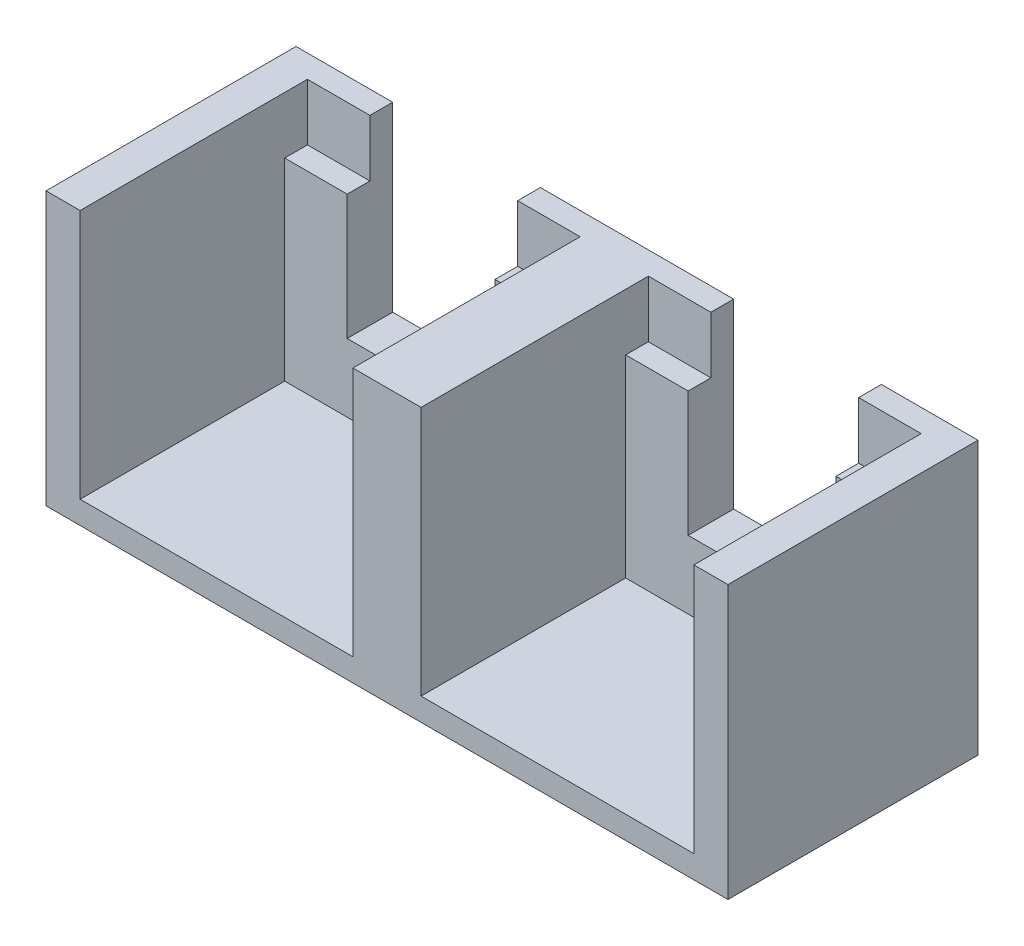
ISO-10303-21;
HEADER;
FILE_DESCRIPTION(('STEP AP214'),'2;1');
FILE_NAME('part.step','',(''),(''),'','','');
FILE_SCHEMA(('AUTOMOTIVE_DESIGN { 1 0 10303 214 1 1 1 1 }'));
ENDSEC;
DATA;
#1=APPLICATION_CONTEXT('core data for automotive mechanical design processes');
#2=APPLICATION_PROTOCOL_DEFINITION('international standard','automotive_design',2000,#1);
#3=PRODUCT_CONTEXT('',#1,'mechanical');
#4=PRODUCT('Part','Part','',(#3));
#5=PRODUCT_RELATED_PRODUCT_CATEGORY('part','',(#4));
#6=PRODUCT_DEFINITION_FORMATION('','',#4);
#7=PRODUCT_DEFINITION_CONTEXT('part definition',#1,'design');
#8=PRODUCT_DEFINITION('design','',#6,#7);
#9=PRODUCT_DEFINITION_SHAPE('','',#8);
#10=(LENGTH_UNIT() NAMED_UNIT(*) SI_UNIT(.MILLI.,.METRE.));
#11=(NAMED_UNIT(*) PLANE_ANGLE_UNIT() SI_UNIT($,.RADIAN.));
#12=(NAMED_UNIT(*) SI_UNIT($,.STERADIAN.) SOLID_ANGLE_UNIT());
#13=UNCERTAINTY_MEASURE_WITH_UNIT(LENGTH_MEASURE(1.E-05),#10,'distance_accuracy_value','');
#14=(GEOMETRIC_REPRESENTATION_CONTEXT(3) GLOBAL_UNCERTAINTY_ASSIGNED_CONTEXT((#13)) GLOBAL_UNIT_ASSIGNED_CONTEXT((#10,
#11,#12)) REPRESENTATION_CONTEXT('',''));
#15=CARTESIAN_POINT('',(0.,0.,0.));
#16=DIRECTION('',(0.,0.,1.));
#17=DIRECTION('',(1.,0.,0.));
#18=AXIS2_PLACEMENT_3D('',#15,#16,#17);
#19=CARTESIAN_POINT('',(-30.,12.,22.));
#20=DIRECTION('',(0.,-1.,0.));
#21=DIRECTION('',(0.,0.,-1.));
#22=AXIS2_PLACEMENT_3D('',#19,#20,#21);
#23=PLANE('',#22);
#24=DIRECTION('',(0.,0.,1.));
#25=VECTOR('',#24,1.);
#26=CARTESIAN_POINT('',(27.,12.,2.));
#27=LINE('',#26,#25);
#28=CARTESIAN_POINT('',(27.,12.,2.));
#29=VERTEX_POINT('',#28);
#30=CARTESIAN_POINT('',(27.,12.,22.));
#31=VERTEX_POINT('',#30);
#32=EDGE_CURVE('E231',#29,#31,#27,.T.);
#33=ORIENTED_EDGE('',*,*,#32,.T.);
#34=DIRECTION('',(-1.,0.,0.));
#35=VECTOR('',#34,1.);
#36=CARTESIAN_POINT('',(-30.,12.,22.));
#37=LINE('',#36,#35);
#38=CARTESIAN_POINT('',(30.,12.,22.));
#39=VERTEX_POINT('',#38);
#40=EDGE_CURVE('E387',#39,#31,#37,.T.);
#41=ORIENTED_EDGE('',*,*,#40,.F.);
#42=DIRECTION('',(0.,0.,-1.));
#43=VECTOR('',#42,1.);
#44=CARTESIAN_POINT('',(30.,12.,22.));
#45=LINE('',#44,#43);
#46=CARTESIAN_POINT('',(30.,12.,0.));
#47=VERTEX_POINT('',#46);
#48=EDGE_CURVE('E414',#39,#47,#45,.T.);
#49=ORIENTED_EDGE('',*,*,#48,.T.);
#50=DIRECTION('',(-1.,0.,0.));
#51=VECTOR('',#50,1.);
#52=CARTESIAN_POINT('',(-30.,12.,0.));
#53=LINE('',#52,#51);
#54=CARTESIAN_POINT('',(21.5,12.,0.));
#55=VERTEX_POINT('',#54);
#56=EDGE_CURVE('E399',#47,#55,#53,.T.);
#57=ORIENTED_EDGE('',*,*,#56,.T.);
#58=DIRECTION('',(0.,0.,1.));
#59=VECTOR('',#58,1.);
#60=CARTESIAN_POINT('',(21.5,12.,-20.6155281280883));
#61=LINE('',#60,#59);
#62=CARTESIAN_POINT('',(21.5,12.,2.));
#63=VERTEX_POINT('',#62);
#64=EDGE_CURVE('E256',#55,#63,#61,.T.);
#65=ORIENTED_EDGE('',*,*,#64,.T.);
#66=DIRECTION('',(1.,0.,0.));
#67=VECTOR('',#66,1.);
#68=CARTESIAN_POINT('',(27.,12.,2.));
#69=LINE('',#68,#67);
#70=EDGE_CURVE('E248',#63,#29,#69,.T.);
#71=ORIENTED_EDGE('',*,*,#70,.T.);
#72=EDGE_LOOP('',(#33,#41,#49,#57,#65,#71));
#73=FACE_BOUND('',#72,.T.);
#74=ADVANCED_FACE('F33',(#73),#23,.F.);
#75=DIRECTION('',(0.,0.,-1.));
#76=VECTOR('',#75,1.);
#77=CARTESIAN_POINT('',(3.,12.,2.));
#78=LINE('',#77,#76);
#79=CARTESIAN_POINT('',(3.,12.,22.));
#80=VERTEX_POINT('',#79);
#81=CARTESIAN_POINT('',(3.,12.,2.));
#82=VERTEX_POINT('',#81);
#83=EDGE_CURVE('E239',#80,#82,#78,.T.);
#84=ORIENTED_EDGE('',*,*,#83,.T.);
#85=CARTESIAN_POINT('',(8.5,12.,2.));
#86=VERTEX_POINT('',#85);
#87=EDGE_CURVE('E242',#82,#86,#69,.T.);
#88=ORIENTED_EDGE('',*,*,#87,.T.);
#89=DIRECTION('',(0.,0.,1.));
#90=VECTOR('',#89,1.);
#91=CARTESIAN_POINT('',(8.5,12.,-20.6155281280883));
#92=LINE('',#91,#90);
#93=CARTESIAN_POINT('',(8.5,12.,0.));
#94=VERTEX_POINT('',#93);
#95=EDGE_CURVE('E265',#94,#86,#92,.T.);
#96=ORIENTED_EDGE('',*,*,#95,.F.);
#97=CARTESIAN_POINT('',(-8.5,12.,0.));
#98=VERTEX_POINT('',#97);
#99=EDGE_CURVE('E403',#94,#98,#53,.T.);
#100=ORIENTED_EDGE('',*,*,#99,.T.);
#101=DIRECTION('',(0.,0.,1.));
#102=VECTOR('',#101,1.);
#103=CARTESIAN_POINT('',(-8.5,12.,-20.6155281280883));
#104=LINE('',#103,#102);
#105=CARTESIAN_POINT('',(-8.5,12.,2.));
#106=VERTEX_POINT('',#105);
#107=EDGE_CURVE('E351',#98,#106,#104,.T.);
#108=ORIENTED_EDGE('',*,*,#107,.T.);
#109=DIRECTION('',(-1.,0.,0.));
#110=VECTOR('',#109,1.);
#111=CARTESIAN_POINT('',(-27.,12.,2.));
#112=LINE('',#111,#110);
#113=CARTESIAN_POINT('',(-3.,12.,2.));
#114=VERTEX_POINT('',#113);
#115=EDGE_CURVE('E307',#114,#106,#112,.T.);
#116=ORIENTED_EDGE('',*,*,#115,.F.);
#117=DIRECTION('',(0.,0.,-1.));
#118=VECTOR('',#117,1.);
#119=CARTESIAN_POINT('',(-3.,12.,2.));
#120=LINE('',#119,#118);
#121=CARTESIAN_POINT('',(-3.,12.,22.));
#122=VERTEX_POINT('',#121);
#123=EDGE_CURVE('E315',#122,#114,#120,.T.);
#124=ORIENTED_EDGE('',*,*,#123,.F.);
#125=EDGE_CURVE('E391',#80,#122,#37,.T.);
#126=ORIENTED_EDGE('',*,*,#125,.F.);
#127=EDGE_LOOP('',(#84,#88,#96,#100,#108,#116,#124,#126));
#128=FACE_BOUND('',#127,.T.);
#129=ADVANCED_FACE('F476',(#128),#23,.F.);
#130=CARTESIAN_POINT('',(0.,0.,22.));
#131=DIRECTION('',(0.,0.,-1.));
#132=DIRECTION('',(-1.,0.,0.));
#133=AXIS2_PLACEMENT_3D('',#130,#131,#132);
#134=PLANE('',#133);
#135=ORIENTED_EDGE('',*,*,#40,.T.);
#136=DIRECTION('',(0.,-1.,0.));
#137=VECTOR('',#136,1.);
#138=CARTESIAN_POINT('',(27.,-10.,22.));
#139=LINE('',#138,#137);
#140=CARTESIAN_POINT('',(27.,-10.,22.));
#141=VERTEX_POINT('',#140);
#142=EDGE_CURVE('E288',#31,#141,#139,.T.);
#143=ORIENTED_EDGE('',*,*,#142,.T.);
#144=DIRECTION('',(-1.,0.,0.));
#145=VECTOR('',#144,1.);
#146=CARTESIAN_POINT('',(27.,-10.,22.));
#147=LINE('',#146,#145);
#148=CARTESIAN_POINT('',(3.,-10.,22.));
#149=VERTEX_POINT('',#148);
#150=EDGE_CURVE('E294',#141,#149,#147,.T.);
#151=ORIENTED_EDGE('',*,*,#150,.T.);
#152=DIRECTION('',(0.,1.,0.));
#153=VECTOR('',#152,1.);
#154=CARTESIAN_POINT('',(3.,-10.,22.));
#155=LINE('',#154,#153);
#156=EDGE_CURVE('E270',#149,#80,#155,.T.);
#157=ORIENTED_EDGE('',*,*,#156,.T.);
#158=ORIENTED_EDGE('',*,*,#125,.T.);
#159=DIRECTION('',(0.,1.,0.));
#160=VECTOR('',#159,1.);
#161=CARTESIAN_POINT('',(-3.,-10.,22.));
#162=LINE('',#161,#160);
#163=CARTESIAN_POINT('',(-3.,-10.,22.));
#164=VERTEX_POINT('',#163);
#165=EDGE_CURVE('E360',#164,#122,#162,.T.);
#166=ORIENTED_EDGE('',*,*,#165,.F.);
#167=DIRECTION('',(1.,0.,0.));
#168=VECTOR('',#167,1.);
#169=CARTESIAN_POINT('',(-27.,-10.,22.));
#170=LINE('',#169,#168);
#171=CARTESIAN_POINT('',(-27.,-10.,22.));
#172=VERTEX_POINT('',#171);
#173=EDGE_CURVE('E365',#172,#164,#170,.T.);
#174=ORIENTED_EDGE('',*,*,#173,.F.);
#175=DIRECTION('',(0.,-1.,0.));
#176=VECTOR('',#175,1.);
#177=CARTESIAN_POINT('',(-27.,-10.,22.));
#178=LINE('',#177,#176);
#179=CARTESIAN_POINT('',(-27.,12.,22.));
#180=VERTEX_POINT('',#179);
#181=EDGE_CURVE('E373',#180,#172,#178,.T.);
#182=ORIENTED_EDGE('',*,*,#181,.F.);
#183=CARTESIAN_POINT('',(-30.,12.,22.));
#184=VERTEX_POINT('',#183);
#185=EDGE_CURVE('E385',#180,#184,#37,.T.);
#186=ORIENTED_EDGE('',*,*,#185,.T.);
#187=DIRECTION('',(0.,-1.,0.));
#188=VECTOR('',#187,1.);
#189=CARTESIAN_POINT('',(-30.,-12.,22.));
#190=LINE('',#189,#188);
#191=CARTESIAN_POINT('',(-30.,-12.,22.));
#192=VERTEX_POINT('',#191);
#193=EDGE_CURVE('E390',#184,#192,#190,.T.);
#194=ORIENTED_EDGE('',*,*,#193,.T.);
#195=DIRECTION('',(1.,0.,0.));
#196=VECTOR('',#195,1.);
#197=CARTESIAN_POINT('',(-30.,-12.,22.));
#198=LINE('',#197,#196);
#199=CARTESIAN_POINT('',(30.,-12.,22.));
#200=VERTEX_POINT('',#199);
#201=EDGE_CURVE('E393',#192,#200,#198,.T.);
#202=ORIENTED_EDGE('',*,*,#201,.T.);
#203=DIRECTION('',(0.,1.,0.));
#204=VECTOR('',#203,1.);
#205=CARTESIAN_POINT('',(30.,-12.,22.));
#206=LINE('',#205,#204);
#207=EDGE_CURVE('E382',#200,#39,#206,.T.);
#208=ORIENTED_EDGE('',*,*,#207,.T.);
#209=EDGE_LOOP('',(#135,#143,#151,#157,#158,#166,#174,#182,#186,#194,#202,#208));
#210=FACE_BOUND('',#209,.T.);
#211=ADVANCED_FACE('F463',(#210),#134,.F.);
#212=CARTESIAN_POINT('',(0.,0.,4.));
#213=DIRECTION('',(0.,0.,-1.));
#214=DIRECTION('',(1.,0.,0.));
#215=AXIS2_PLACEMENT_3D('',#212,#213,#214);
#216=PLANE('',#215);
#217=DIRECTION('',(1.,0.,0.));
#218=VECTOR('',#217,1.);
#219=CARTESIAN_POINT('',(0.,7.,4.));
#220=LINE('',#219,#218);
#221=CARTESIAN_POINT('',(3.,7.,4.));
#222=VERTEX_POINT('',#221);
#223=CARTESIAN_POINT('',(8.5,7.,4.));
#224=VERTEX_POINT('',#223);
#225=EDGE_CURVE('E56',#222,#224,#220,.T.);
#226=ORIENTED_EDGE('',*,*,#225,.F.);
#227=DIRECTION('',(0.,1.,0.));
#228=VECTOR('',#227,1.);
#229=CARTESIAN_POINT('',(3.,-10.,4.));
#230=LINE('',#229,#228);
#231=CARTESIAN_POINT('',(3.,-10.,4.));
#232=VERTEX_POINT('',#231);
#233=EDGE_CURVE('E284',#232,#222,#230,.T.);
#234=ORIENTED_EDGE('',*,*,#233,.F.);
#235=DIRECTION('',(-1.,0.,0.));
#236=VECTOR('',#235,1.);
#237=CARTESIAN_POINT('',(27.,-10.,4.));
#238=LINE('',#237,#236);
#239=CARTESIAN_POINT('',(27.,-10.,4.));
#240=VERTEX_POINT('',#239);
#241=EDGE_CURVE('E287',#240,#232,#238,.T.);
#242=ORIENTED_EDGE('',*,*,#241,.F.);
#243=DIRECTION('',(0.,-1.,0.));
#244=VECTOR('',#243,1.);
#245=CARTESIAN_POINT('',(27.,-10.,4.));
#246=LINE('',#245,#244);
#247=CARTESIAN_POINT('',(27.,7.,4.));
#248=VERTEX_POINT('',#247);
#249=EDGE_CURVE('E290',#248,#240,#246,.T.);
#250=ORIENTED_EDGE('',*,*,#249,.F.);
#251=CARTESIAN_POINT('',(21.5,7.,4.));
#252=VERTEX_POINT('',#251);
#253=EDGE_CURVE('E238',#252,#248,#220,.T.);
#254=ORIENTED_EDGE('',*,*,#253,.F.);
#255=DIRECTION('',(0.,-1.,0.));
#256=VECTOR('',#255,1.);
#257=CARTESIAN_POINT('',(21.5,12.,4.));
#258=LINE('',#257,#256);
#259=CARTESIAN_POINT('',(21.5,-4.,4.));
#260=VERTEX_POINT('',#259);
#261=EDGE_CURVE('E266',#252,#260,#258,.T.);
#262=ORIENTED_EDGE('',*,*,#261,.T.);
#263=DIRECTION('',(-1.,0.,0.));
#264=VECTOR('',#263,1.);
#265=CARTESIAN_POINT('',(21.5,-4.,4.));
#266=LINE('',#265,#264);
#267=CARTESIAN_POINT('',(8.5,-4.,4.));
#268=VERTEX_POINT('',#267);
#269=EDGE_CURVE('E257',#260,#268,#266,.T.);
#270=ORIENTED_EDGE('',*,*,#269,.T.);
#271=DIRECTION('',(0.,1.,0.));
#272=VECTOR('',#271,1.);
#273=CARTESIAN_POINT('',(8.5,12.,4.));
#274=LINE('',#273,#272);
#275=EDGE_CURVE('E262',#268,#224,#274,.T.);
#276=ORIENTED_EDGE('',*,*,#275,.T.);
#277=EDGE_LOOP('',(#226,#234,#242,#250,#254,#262,#270,#276));
#278=FACE_BOUND('',#277,.T.);
#279=ADVANCED_FACE('F426',(#278),#216,.F.);
#280=CARTESIAN_POINT('',(21.5,12.,-20.6155281280883));
#281=DIRECTION('',(-1.,0.,0.));
#282=DIRECTION('',(0.,-1.,0.));
#283=AXIS2_PLACEMENT_3D('',#280,#281,#282);
#284=PLANE('',#283);
#285=DIRECTION('',(0.,0.,-1.));
#286=VECTOR('',#285,1.);
#287=CARTESIAN_POINT('',(21.5,7.,-20.6155281280883));
#288=LINE('',#287,#286);
#289=CARTESIAN_POINT('',(21.5,7.,2.));
#290=VERTEX_POINT('',#289);
#291=EDGE_CURVE('E253',#252,#290,#288,.T.);
#292=ORIENTED_EDGE('',*,*,#291,.T.);
#293=DIRECTION('',(0.,1.,0.));
#294=VECTOR('',#293,1.);
#295=CARTESIAN_POINT('',(21.5,12.,2.));
#296=LINE('',#295,#294);
#297=EDGE_CURVE('E221',#290,#63,#296,.T.);
#298=ORIENTED_EDGE('',*,*,#297,.T.);
#299=ORIENTED_EDGE('',*,*,#64,.F.);
#300=DIRECTION('',(0.,-1.,0.));
#301=VECTOR('',#300,1.);
#302=CARTESIAN_POINT('',(21.5,12.,0.));
#303=LINE('',#302,#301);
#304=CARTESIAN_POINT('',(21.5,-4.,0.));
#305=VERTEX_POINT('',#304);
#306=EDGE_CURVE('E273',#55,#305,#303,.T.);
#307=ORIENTED_EDGE('',*,*,#306,.T.);
#308=DIRECTION('',(0.,0.,1.));
#309=VECTOR('',#308,1.);
#310=CARTESIAN_POINT('',(21.5,-4.,-20.6155281280883));
#311=LINE('',#310,#309);
#312=EDGE_CURVE('E261',#305,#260,#311,.T.);
#313=ORIENTED_EDGE('',*,*,#312,.T.);
#314=ORIENTED_EDGE('',*,*,#261,.F.);
#315=EDGE_LOOP('',(#292,#298,#299,#307,#313,#314));
#316=FACE_BOUND('',#315,.T.);
#317=ADVANCED_FACE('F636',(#316),#284,.T.);
#318=CARTESIAN_POINT('',(8.5,12.,-20.6155281280883));
#319=DIRECTION('',(1.,0.,0.));
#320=DIRECTION('',(0.,0.,-1.));
#321=AXIS2_PLACEMENT_3D('',#318,#319,#320);
#322=PLANE('',#321);
#323=ORIENTED_EDGE('',*,*,#95,.T.);
#324=DIRECTION('',(0.,-1.,0.));
#325=VECTOR('',#324,1.);
#326=CARTESIAN_POINT('',(8.5,12.,2.));
#327=LINE('',#326,#325);
#328=CARTESIAN_POINT('',(8.5,7.,2.));
#329=VERTEX_POINT('',#328);
#330=EDGE_CURVE('E11',#86,#329,#327,.T.);
#331=ORIENTED_EDGE('',*,*,#330,.T.);
#332=DIRECTION('',(0.,0.,1.));
#333=VECTOR('',#332,1.);
#334=CARTESIAN_POINT('',(8.5,7.,-20.6155281280883));
#335=LINE('',#334,#333);
#336=EDGE_CURVE('E41',#329,#224,#335,.T.);
#337=ORIENTED_EDGE('',*,*,#336,.T.);
#338=ORIENTED_EDGE('',*,*,#275,.F.);
#339=DIRECTION('',(0.,0.,1.));
#340=VECTOR('',#339,1.);
#341=CARTESIAN_POINT('',(8.5,-4.,-20.6155281280883));
#342=LINE('',#341,#340);
#343=CARTESIAN_POINT('',(8.5,-4.,0.));
#344=VERTEX_POINT('',#343);
#345=EDGE_CURVE('E260',#344,#268,#342,.T.);
#346=ORIENTED_EDGE('',*,*,#345,.F.);
#347=DIRECTION('',(0.,1.,0.));
#348=VECTOR('',#347,1.);
#349=CARTESIAN_POINT('',(8.5,12.,0.));
#350=LINE('',#349,#348);
#351=EDGE_CURVE('E268',#344,#94,#350,.T.);
#352=ORIENTED_EDGE('',*,*,#351,.T.);
#353=EDGE_LOOP('',(#323,#331,#337,#338,#346,#352));
#354=FACE_BOUND('',#353,.T.);
#355=ADVANCED_FACE('F422',(#354),#322,.T.);
#356=CARTESIAN_POINT('',(0.,0.,0.));
#357=DIRECTION('',(0.,0.,-1.));
#358=DIRECTION('',(-1.,0.,0.));
#359=AXIS2_PLACEMENT_3D('',#356,#357,#358);
#360=PLANE('',#359);
#361=DIRECTION('',(-1.,0.,0.));
#362=VECTOR('',#361,1.);
#363=CARTESIAN_POINT('',(21.5,-4.,0.));
#364=LINE('',#363,#362);
#365=EDGE_CURVE('E271',#305,#344,#364,.T.);
#366=ORIENTED_EDGE('',*,*,#365,.F.);
#367=ORIENTED_EDGE('',*,*,#306,.F.);
#368=ORIENTED_EDGE('',*,*,#56,.F.);
#369=DIRECTION('',(0.,1.,0.));
#370=VECTOR('',#369,1.);
#371=CARTESIAN_POINT('',(30.,-12.,0.));
#372=LINE('',#371,#370);
#373=CARTESIAN_POINT('',(30.,-12.,0.));
#374=VERTEX_POINT('',#373);
#375=EDGE_CURVE('E379',#374,#47,#372,.T.);
#376=ORIENTED_EDGE('',*,*,#375,.F.);
#377=DIRECTION('',(1.,0.,0.));
#378=VECTOR('',#377,1.);
#379=CARTESIAN_POINT('',(-30.,-12.,0.));
#380=LINE('',#379,#378);
#381=CARTESIAN_POINT('',(-30.,-12.,0.));
#382=VERTEX_POINT('',#381);
#383=EDGE_CURVE('E386',#382,#374,#380,.T.);
#384=ORIENTED_EDGE('',*,*,#383,.F.);
#385=DIRECTION('',(0.,-1.,0.));
#386=VECTOR('',#385,1.);
#387=CARTESIAN_POINT('',(-30.,-12.,0.));
#388=LINE('',#387,#386);
#389=CARTESIAN_POINT('',(-30.,12.,0.));
#390=VERTEX_POINT('',#389);
#391=EDGE_CURVE('E402',#390,#382,#388,.T.);
#392=ORIENTED_EDGE('',*,*,#391,.F.);
#393=CARTESIAN_POINT('',(-21.5,12.,0.));
#394=VERTEX_POINT('',#393);
#395=EDGE_CURVE('E398',#394,#390,#53,.T.);
#396=ORIENTED_EDGE('',*,*,#395,.F.);
#397=DIRECTION('',(0.,-1.,0.));
#398=VECTOR('',#397,1.);
#399=CARTESIAN_POINT('',(-21.5,12.,0.));
#400=LINE('',#399,#398);
#401=CARTESIAN_POINT('',(-21.5,-4.,0.));
#402=VERTEX_POINT('',#401);
#403=EDGE_CURVE('E343',#394,#402,#400,.T.);
#404=ORIENTED_EDGE('',*,*,#403,.T.);
#405=DIRECTION('',(1.,0.,0.));
#406=VECTOR('',#405,1.);
#407=CARTESIAN_POINT('',(-21.5,-4.,0.));
#408=LINE('',#407,#406);
#409=CARTESIAN_POINT('',(-8.5,-4.,0.));
#410=VERTEX_POINT('',#409);
#411=EDGE_CURVE('E336',#402,#410,#408,.T.);
#412=ORIENTED_EDGE('',*,*,#411,.T.);
#413=DIRECTION('',(0.,1.,0.));
#414=VECTOR('',#413,1.);
#415=CARTESIAN_POINT('',(-8.5,12.,0.));
#416=LINE('',#415,#414);
#417=EDGE_CURVE('E348',#410,#98,#416,.T.);
#418=ORIENTED_EDGE('',*,*,#417,.T.);
#419=ORIENTED_EDGE('',*,*,#99,.F.);
#420=ORIENTED_EDGE('',*,*,#351,.F.);
#421=EDGE_LOOP('',(#366,#367,#368,#376,#384,#392,#396,#404,#412,#418,#419,#420));
#422=FACE_BOUND('',#421,.T.);
#423=ADVANCED_FACE('F437',(#422),#360,.T.);
#424=CARTESIAN_POINT('',(0.,0.,4.));
#425=DIRECTION('',(0.,0.,-1.));
#426=DIRECTION('',(-1.,0.,0.));
#427=AXIS2_PLACEMENT_3D('',#424,#425,#426);
#428=PLANE('',#427);
#429=DIRECTION('',(1.,0.,0.));
#430=VECTOR('',#429,1.);
#431=CARTESIAN_POINT('',(0.,7.,4.));
#432=LINE('',#431,#430);
#433=CARTESIAN_POINT('',(-27.,7.,4.));
#434=VERTEX_POINT('',#433);
#435=CARTESIAN_POINT('',(-21.5,7.,4.));
#436=VERTEX_POINT('',#435);
#437=EDGE_CURVE('E323',#434,#436,#432,.T.);
#438=ORIENTED_EDGE('',*,*,#437,.F.);
#439=DIRECTION('',(0.,-1.,0.));
#440=VECTOR('',#439,1.);
#441=CARTESIAN_POINT('',(-27.,-10.,4.));
#442=LINE('',#441,#440);
#443=CARTESIAN_POINT('',(-27.,-10.,4.));
#444=VERTEX_POINT('',#443);
#445=EDGE_CURVE('E364',#434,#444,#442,.T.);
#446=ORIENTED_EDGE('',*,*,#445,.T.);
#447=DIRECTION('',(1.,0.,0.));
#448=VECTOR('',#447,1.);
#449=CARTESIAN_POINT('',(-27.,-10.,4.));
#450=LINE('',#449,#448);
#451=CARTESIAN_POINT('',(-3.,-10.,4.));
#452=VERTEX_POINT('',#451);
#453=EDGE_CURVE('E367',#444,#452,#450,.T.);
#454=ORIENTED_EDGE('',*,*,#453,.T.);
#455=DIRECTION('',(0.,1.,0.));
#456=VECTOR('',#455,1.);
#457=CARTESIAN_POINT('',(-3.,-10.,4.));
#458=LINE('',#457,#456);
#459=CARTESIAN_POINT('',(-3.,7.,4.));
#460=VERTEX_POINT('',#459);
#461=EDGE_CURVE('E361',#452,#460,#458,.T.);
#462=ORIENTED_EDGE('',*,*,#461,.T.);
#463=CARTESIAN_POINT('',(-8.5,7.,4.));
#464=VERTEX_POINT('',#463);
#465=EDGE_CURVE('E327',#464,#460,#432,.T.);
#466=ORIENTED_EDGE('',*,*,#465,.F.);
#467=DIRECTION('',(0.,1.,0.));
#468=VECTOR('',#467,1.);
#469=CARTESIAN_POINT('',(-8.5,12.,4.));
#470=LINE('',#469,#468);
#471=CARTESIAN_POINT('',(-8.5,-4.,4.));
#472=VERTEX_POINT('',#471);
#473=EDGE_CURVE('E333',#472,#464,#470,.T.);
#474=ORIENTED_EDGE('',*,*,#473,.F.);
#475=DIRECTION('',(1.,0.,0.));
#476=VECTOR('',#475,1.);
#477=CARTESIAN_POINT('',(-21.5,-4.,4.));
#478=LINE('',#477,#476);
#479=CARTESIAN_POINT('',(-21.5,-4.,4.));
#480=VERTEX_POINT('',#479);
#481=EDGE_CURVE('E337',#480,#472,#478,.T.);
#482=ORIENTED_EDGE('',*,*,#481,.F.);
#483=DIRECTION('',(0.,-1.,0.));
#484=VECTOR('',#483,1.);
#485=CARTESIAN_POINT('',(-21.5,12.,4.));
#486=LINE('',#485,#484);
#487=EDGE_CURVE('E332',#436,#480,#486,.T.);
#488=ORIENTED_EDGE('',*,*,#487,.F.);
#489=EDGE_LOOP('',(#438,#446,#454,#462,#466,#474,#482,#488));
#490=FACE_BOUND('',#489,.T.);
#491=ADVANCED_FACE('F490',(#490),#428,.F.);
#492=ORIENTED_EDGE('',*,*,#185,.F.);
#493=DIRECTION('',(0.,0.,1.));
#494=VECTOR('',#493,1.);
#495=CARTESIAN_POINT('',(-27.,12.,2.));
#496=LINE('',#495,#494);
#497=CARTESIAN_POINT('',(-27.,12.,2.));
#498=VERTEX_POINT('',#497);
#499=EDGE_CURVE('E301',#498,#180,#496,.T.);
#500=ORIENTED_EDGE('',*,*,#499,.F.);
#501=CARTESIAN_POINT('',(-21.5,12.,2.));
#502=VERTEX_POINT('',#501);
#503=EDGE_CURVE('E318',#502,#498,#112,.T.);
#504=ORIENTED_EDGE('',*,*,#503,.F.);
#505=DIRECTION('',(0.,0.,1.));
#506=VECTOR('',#505,1.);
#507=CARTESIAN_POINT('',(-21.5,12.,-20.6155281280883));
#508=LINE('',#507,#506);
#509=EDGE_CURVE('E347',#394,#502,#508,.T.);
#510=ORIENTED_EDGE('',*,*,#509,.F.);
#511=ORIENTED_EDGE('',*,*,#395,.T.);
#512=DIRECTION('',(0.,0.,-1.));
#513=VECTOR('',#512,1.);
#514=CARTESIAN_POINT('',(-30.,12.,22.));
#515=LINE('',#514,#513);
#516=EDGE_CURVE('E411',#184,#390,#515,.T.);
#517=ORIENTED_EDGE('',*,*,#516,.F.);
#518=EDGE_LOOP('',(#492,#500,#504,#510,#511,#517));
#519=FACE_BOUND('',#518,.T.);
#520=ADVANCED_FACE('F446',(#519),#23,.F.);
#521=CARTESIAN_POINT('',(30.,-12.,22.));
#522=DIRECTION('',(-1.,0.,0.));
#523=DIRECTION('',(0.,0.,1.));
#524=AXIS2_PLACEMENT_3D('',#521,#522,#523);
#525=PLANE('',#524);
#526=ORIENTED_EDGE('',*,*,#375,.T.);
#527=ORIENTED_EDGE('',*,*,#48,.F.);
#528=ORIENTED_EDGE('',*,*,#207,.F.);
#529=DIRECTION('',(0.,0.,-1.));
#530=VECTOR('',#529,1.);
#531=CARTESIAN_POINT('',(30.,-12.,22.));
#532=LINE('',#531,#530);
#533=EDGE_CURVE('E395',#200,#374,#532,.T.);
#534=ORIENTED_EDGE('',*,*,#533,.T.);
#535=EDGE_LOOP('',(#526,#527,#528,#534));
#536=FACE_BOUND('',#535,.T.);
#537=ADVANCED_FACE('F35',(#536),#525,.F.);
#538=CARTESIAN_POINT('',(-30.,-12.,22.));
#539=DIRECTION('',(1.,0.,0.));
#540=DIRECTION('',(0.,0.,-1.));
#541=AXIS2_PLACEMENT_3D('',#538,#539,#540);
#542=PLANE('',#541);
#543=ORIENTED_EDGE('',*,*,#391,.T.);
#544=DIRECTION('',(0.,0.,-1.));
#545=VECTOR('',#544,1.);
#546=CARTESIAN_POINT('',(-30.,-12.,22.));
#547=LINE('',#546,#545);
#548=EDGE_CURVE('E408',#192,#382,#547,.T.);
#549=ORIENTED_EDGE('',*,*,#548,.F.);
#550=ORIENTED_EDGE('',*,*,#193,.F.);
#551=ORIENTED_EDGE('',*,*,#516,.T.);
#552=EDGE_LOOP('',(#543,#549,#550,#551));
#553=FACE_BOUND('',#552,.T.);
#554=ADVANCED_FACE('F451',(#553),#542,.F.);
#555=CARTESIAN_POINT('',(-30.,-12.,22.));
#556=DIRECTION('',(0.,1.,0.));
#557=DIRECTION('',(0.,0.,1.));
#558=AXIS2_PLACEMENT_3D('',#555,#556,#557);
#559=PLANE('',#558);
#560=ORIENTED_EDGE('',*,*,#383,.T.);
#561=ORIENTED_EDGE('',*,*,#533,.F.);
#562=ORIENTED_EDGE('',*,*,#201,.F.);
#563=ORIENTED_EDGE('',*,*,#548,.T.);
#564=EDGE_LOOP('',(#560,#561,#562,#563));
#565=FACE_BOUND('',#564,.T.);
#566=ADVANCED_FACE('F457',(#565),#559,.F.);
#567=CARTESIAN_POINT('',(-3.,-10.,4.));
#568=DIRECTION('',(1.,0.,0.));
#569=DIRECTION('',(0.,0.,-1.));
#570=AXIS2_PLACEMENT_3D('',#567,#568,#569);
#571=PLANE('',#570);
#572=DIRECTION('',(0.,0.,-1.));
#573=VECTOR('',#572,1.);
#574=CARTESIAN_POINT('',(-3.,7.,2.));
#575=LINE('',#574,#573);
#576=CARTESIAN_POINT('',(-3.,7.,2.));
#577=VERTEX_POINT('',#576);
#578=EDGE_CURVE('E306',#460,#577,#575,.T.);
#579=ORIENTED_EDGE('',*,*,#578,.F.);
#580=ORIENTED_EDGE('',*,*,#461,.F.);
#581=DIRECTION('',(0.,0.,1.));
#582=VECTOR('',#581,1.);
#583=CARTESIAN_POINT('',(-3.,-10.,4.));
#584=LINE('',#583,#582);
#585=EDGE_CURVE('E377',#452,#164,#584,.T.);
#586=ORIENTED_EDGE('',*,*,#585,.T.);
#587=ORIENTED_EDGE('',*,*,#165,.T.);
#588=ORIENTED_EDGE('',*,*,#123,.T.);
#589=DIRECTION('',(0.,1.,0.));
#590=VECTOR('',#589,1.);
#591=CARTESIAN_POINT('',(-3.,7.,2.));
#592=LINE('',#591,#590);
#593=EDGE_CURVE('E312',#577,#114,#592,.T.);
#594=ORIENTED_EDGE('',*,*,#593,.F.);
#595=EDGE_LOOP('',(#579,#580,#586,#587,#588,#594));
#596=FACE_BOUND('',#595,.T.);
#597=ADVANCED_FACE('F472',(#596),#571,.F.);
#598=CARTESIAN_POINT('',(-27.,-10.,4.));
#599=DIRECTION('',(0.,-1.,0.));
#600=DIRECTION('',(0.,0.,-1.));
#601=AXIS2_PLACEMENT_3D('',#598,#599,#600);
#602=PLANE('',#601);
#603=ORIENTED_EDGE('',*,*,#173,.T.);
#604=ORIENTED_EDGE('',*,*,#585,.F.);
#605=ORIENTED_EDGE('',*,*,#453,.F.);
#606=DIRECTION('',(0.,0.,1.));
#607=VECTOR('',#606,1.);
#608=CARTESIAN_POINT('',(-27.,-10.,4.));
#609=LINE('',#608,#607);
#610=EDGE_CURVE('E370',#444,#172,#609,.T.);
#611=ORIENTED_EDGE('',*,*,#610,.T.);
#612=EDGE_LOOP('',(#603,#604,#605,#611));
#613=FACE_BOUND('',#612,.T.);
#614=ADVANCED_FACE('F496',(#613),#602,.F.);
#615=CARTESIAN_POINT('',(-27.,-10.,4.));
#616=DIRECTION('',(-1.,0.,0.));
#617=DIRECTION('',(0.,0.,1.));
#618=AXIS2_PLACEMENT_3D('',#615,#616,#617);
#619=PLANE('',#618);
#620=ORIENTED_EDGE('',*,*,#445,.F.);
#621=DIRECTION('',(0.,0.,1.));
#622=VECTOR('',#621,1.);
#623=CARTESIAN_POINT('',(-27.,7.,2.));
#624=LINE('',#623,#622);
#625=CARTESIAN_POINT('',(-27.,7.,2.));
#626=VERTEX_POINT('',#625);
#627=EDGE_CURVE('E304',#626,#434,#624,.T.);
#628=ORIENTED_EDGE('',*,*,#627,.F.);
#629=DIRECTION('',(0.,1.,0.));
#630=VECTOR('',#629,1.);
#631=CARTESIAN_POINT('',(-27.,7.,2.));
#632=LINE('',#631,#630);
#633=EDGE_CURVE('E320',#626,#498,#632,.T.);
#634=ORIENTED_EDGE('',*,*,#633,.T.);
#635=ORIENTED_EDGE('',*,*,#499,.T.);
#636=ORIENTED_EDGE('',*,*,#181,.T.);
#637=ORIENTED_EDGE('',*,*,#610,.F.);
#638=EDGE_LOOP('',(#620,#628,#634,#635,#636,#637));
#639=FACE_BOUND('',#638,.T.);
#640=ADVANCED_FACE('F498',(#639),#619,.F.);
#641=CARTESIAN_POINT('',(-21.5,-4.,-20.6155281280883));
#642=DIRECTION('',(0.,-1.,0.));
#643=DIRECTION('',(1.,0.,0.));
#644=AXIS2_PLACEMENT_3D('',#641,#642,#643);
#645=PLANE('',#644);
#646=DIRECTION('',(0.,0.,1.));
#647=VECTOR('',#646,1.);
#648=CARTESIAN_POINT('',(-21.5,-4.,-20.6155281280883));
#649=LINE('',#648,#647);
#650=EDGE_CURVE('E346',#402,#480,#649,.T.);
#651=ORIENTED_EDGE('',*,*,#650,.T.);
#652=ORIENTED_EDGE('',*,*,#481,.T.);
#653=DIRECTION('',(0.,0.,1.));
#654=VECTOR('',#653,1.);
#655=CARTESIAN_POINT('',(-8.5,-4.,-20.6155281280883));
#656=LINE('',#655,#654);
#657=EDGE_CURVE('E342',#410,#472,#656,.T.);
#658=ORIENTED_EDGE('',*,*,#657,.F.);
#659=ORIENTED_EDGE('',*,*,#411,.F.);
#660=EDGE_LOOP('',(#651,#652,#658,#659));
#661=FACE_BOUND('',#660,.T.);
#662=ADVANCED_FACE('F508',(#661),#645,.F.);
#663=CARTESIAN_POINT('',(-8.5,12.,-20.6155281280883));
#664=DIRECTION('',(1.,0.,0.));
#665=DIRECTION('',(0.,0.,-1.));
#666=AXIS2_PLACEMENT_3D('',#663,#664,#665);
#667=PLANE('',#666);
#668=DIRECTION('',(0.,0.,1.));
#669=VECTOR('',#668,1.);
#670=CARTESIAN_POINT('',(-8.5,7.,-20.6155281280883));
#671=LINE('',#670,#669);
#672=CARTESIAN_POINT('',(-8.5,7.,2.));
#673=VERTEX_POINT('',#672);
#674=EDGE_CURVE('E326',#673,#464,#671,.T.);
#675=ORIENTED_EDGE('',*,*,#674,.F.);
#676=DIRECTION('',(0.,1.,0.));
#677=VECTOR('',#676,1.);
#678=CARTESIAN_POINT('',(-8.5,12.,2.));
#679=LINE('',#678,#677);
#680=EDGE_CURVE('E329',#673,#106,#679,.T.);
#681=ORIENTED_EDGE('',*,*,#680,.T.);
#682=ORIENTED_EDGE('',*,*,#107,.F.);
#683=ORIENTED_EDGE('',*,*,#417,.F.);
#684=ORIENTED_EDGE('',*,*,#657,.T.);
#685=ORIENTED_EDGE('',*,*,#473,.T.);
#686=EDGE_LOOP('',(#675,#681,#682,#683,#684,#685));
#687=FACE_BOUND('',#686,.T.);
#688=ADVANCED_FACE('F483',(#687),#667,.F.);
#689=CARTESIAN_POINT('',(-21.5,12.,-20.6155281280883));
#690=DIRECTION('',(-1.,0.,0.));
#691=DIRECTION('',(0.,-1.,0.));
#692=AXIS2_PLACEMENT_3D('',#689,#690,#691);
#693=PLANE('',#692);
#694=ORIENTED_EDGE('',*,*,#509,.T.);
#695=DIRECTION('',(0.,-1.,0.));
#696=VECTOR('',#695,1.);
#697=CARTESIAN_POINT('',(-21.5,12.,2.));
#698=LINE('',#697,#696);
#699=CARTESIAN_POINT('',(-21.5,7.,2.));
#700=VERTEX_POINT('',#699);
#701=EDGE_CURVE('E419',#502,#700,#698,.T.);
#702=ORIENTED_EDGE('',*,*,#701,.T.);
#703=DIRECTION('',(0.,0.,-1.));
#704=VECTOR('',#703,1.);
#705=CARTESIAN_POINT('',(-21.5,7.,-20.6155281280883));
#706=LINE('',#705,#704);
#707=EDGE_CURVE('E417',#436,#700,#706,.T.);
#708=ORIENTED_EDGE('',*,*,#707,.F.);
#709=ORIENTED_EDGE('',*,*,#487,.T.);
#710=ORIENTED_EDGE('',*,*,#650,.F.);
#711=ORIENTED_EDGE('',*,*,#403,.F.);
#712=EDGE_LOOP('',(#694,#702,#708,#709,#710,#711));
#713=FACE_BOUND('',#712,.T.);
#714=ADVANCED_FACE('F503',(#713),#693,.F.);
#715=CARTESIAN_POINT('',(0.,7.,0.));
#716=DIRECTION('',(0.,1.,0.));
#717=DIRECTION('',(0.,0.,1.));
#718=AXIS2_PLACEMENT_3D('',#715,#716,#717);
#719=PLANE('',#718);
#720=ORIENTED_EDGE('',*,*,#437,.T.);
#721=ORIENTED_EDGE('',*,*,#707,.T.);
#722=DIRECTION('',(-1.,0.,0.));
#723=VECTOR('',#722,1.);
#724=CARTESIAN_POINT('',(-27.,7.,2.));
#725=LINE('',#724,#723);
#726=EDGE_CURVE('E309',#700,#626,#725,.T.);
#727=ORIENTED_EDGE('',*,*,#726,.T.);
#728=ORIENTED_EDGE('',*,*,#627,.T.);
#729=EDGE_LOOP('',(#720,#721,#727,#728));
#730=FACE_BOUND('',#729,.T.);
#731=ADVANCED_FACE('F512',(#730),#719,.T.);
#732=CARTESIAN_POINT('',(-27.,7.,2.));
#733=DIRECTION('',(0.,0.,-1.));
#734=DIRECTION('',(-1.,0.,0.));
#735=AXIS2_PLACEMENT_3D('',#732,#733,#734);
#736=PLANE('',#735);
#737=ORIENTED_EDGE('',*,*,#503,.T.);
#738=ORIENTED_EDGE('',*,*,#633,.F.);
#739=ORIENTED_EDGE('',*,*,#726,.F.);
#740=ORIENTED_EDGE('',*,*,#701,.F.);
#741=EDGE_LOOP('',(#737,#738,#739,#740));
#742=FACE_BOUND('',#741,.T.);
#743=ADVANCED_FACE('F513',(#742),#736,.F.);
#744=EDGE_CURVE('E310',#577,#673,#725,.T.);
#745=ORIENTED_EDGE('',*,*,#744,.F.);
#746=ORIENTED_EDGE('',*,*,#593,.T.);
#747=ORIENTED_EDGE('',*,*,#115,.T.);
#748=ORIENTED_EDGE('',*,*,#680,.F.);
#749=EDGE_LOOP('',(#745,#746,#747,#748));
#750=FACE_BOUND('',#749,.T.);
#751=ADVANCED_FACE('F480',(#750),#736,.F.);
#752=ORIENTED_EDGE('',*,*,#465,.T.);
#753=ORIENTED_EDGE('',*,*,#578,.T.);
#754=ORIENTED_EDGE('',*,*,#744,.T.);
#755=ORIENTED_EDGE('',*,*,#674,.T.);
#756=EDGE_LOOP('',(#752,#753,#754,#755));
#757=FACE_BOUND('',#756,.T.);
#758=ADVANCED_FACE('F487',(#757),#719,.T.);
#759=CARTESIAN_POINT('',(3.,-10.,4.));
#760=DIRECTION('',(1.,0.,0.));
#761=DIRECTION('',(0.,0.,-1.));
#762=AXIS2_PLACEMENT_3D('',#759,#760,#761);
#763=PLANE('',#762);
#764=ORIENTED_EDGE('',*,*,#83,.F.);
#765=ORIENTED_EDGE('',*,*,#156,.F.);
#766=DIRECTION('',(0.,0.,1.));
#767=VECTOR('',#766,1.);
#768=CARTESIAN_POINT('',(3.,-10.,4.));
#769=LINE('',#768,#767);
#770=EDGE_CURVE('E292',#232,#149,#769,.T.);
#771=ORIENTED_EDGE('',*,*,#770,.F.);
#772=ORIENTED_EDGE('',*,*,#233,.T.);
#773=DIRECTION('',(0.,0.,-1.));
#774=VECTOR('',#773,1.);
#775=CARTESIAN_POINT('',(3.,7.,2.));
#776=LINE('',#775,#774);
#777=CARTESIAN_POINT('',(3.,7.,2.));
#778=VERTEX_POINT('',#777);
#779=EDGE_CURVE('E234',#222,#778,#776,.T.);
#780=ORIENTED_EDGE('',*,*,#779,.T.);
#781=DIRECTION('',(0.,1.,0.));
#782=VECTOR('',#781,1.);
#783=CARTESIAN_POINT('',(3.,7.,2.));
#784=LINE('',#783,#782);
#785=EDGE_CURVE('E233',#778,#82,#784,.T.);
#786=ORIENTED_EDGE('',*,*,#785,.T.);
#787=EDGE_LOOP('',(#764,#765,#771,#772,#780,#786));
#788=FACE_BOUND('',#787,.T.);
#789=ADVANCED_FACE('F608',(#788),#763,.T.);
#790=CARTESIAN_POINT('',(27.,-10.,4.));
#791=DIRECTION('',(-1.,0.,0.));
#792=DIRECTION('',(0.,0.,1.));
#793=AXIS2_PLACEMENT_3D('',#790,#791,#792);
#794=PLANE('',#793);
#795=ORIENTED_EDGE('',*,*,#142,.F.);
#796=ORIENTED_EDGE('',*,*,#32,.F.);
#797=DIRECTION('',(0.,1.,0.));
#798=VECTOR('',#797,1.);
#799=CARTESIAN_POINT('',(27.,7.,2.));
#800=LINE('',#799,#798);
#801=CARTESIAN_POINT('',(27.,7.,2.));
#802=VERTEX_POINT('',#801);
#803=EDGE_CURVE('E218',#802,#29,#800,.T.);
#804=ORIENTED_EDGE('',*,*,#803,.F.);
#805=DIRECTION('',(0.,0.,1.));
#806=VECTOR('',#805,1.);
#807=CARTESIAN_POINT('',(27.,7.,2.));
#808=LINE('',#807,#806);
#809=EDGE_CURVE('E224',#802,#248,#808,.T.);
#810=ORIENTED_EDGE('',*,*,#809,.T.);
#811=ORIENTED_EDGE('',*,*,#249,.T.);
#812=DIRECTION('',(0.,0.,1.));
#813=VECTOR('',#812,1.);
#814=CARTESIAN_POINT('',(27.,-10.,4.));
#815=LINE('',#814,#813);
#816=EDGE_CURVE('E298',#240,#141,#815,.T.);
#817=ORIENTED_EDGE('',*,*,#816,.T.);
#818=EDGE_LOOP('',(#795,#796,#804,#810,#811,#817));
#819=FACE_BOUND('',#818,.T.);
#820=ADVANCED_FACE('F228',(#819),#794,.T.);
#821=CARTESIAN_POINT('',(27.,-10.,4.));
#822=DIRECTION('',(0.,1.,0.));
#823=DIRECTION('',(0.,0.,1.));
#824=AXIS2_PLACEMENT_3D('',#821,#822,#823);
#825=PLANE('',#824);
#826=ORIENTED_EDGE('',*,*,#150,.F.);
#827=ORIENTED_EDGE('',*,*,#816,.F.);
#828=ORIENTED_EDGE('',*,*,#241,.T.);
#829=ORIENTED_EDGE('',*,*,#770,.T.);
#830=EDGE_LOOP('',(#826,#827,#828,#829));
#831=FACE_BOUND('',#830,.T.);
#832=ADVANCED_FACE('F677',(#831),#825,.T.);
#833=CARTESIAN_POINT('',(21.5,-4.,-20.6155281280883));
#834=DIRECTION('',(0.,1.,0.));
#835=DIRECTION('',(-1.,0.,0.));
#836=AXIS2_PLACEMENT_3D('',#833,#834,#835);
#837=PLANE('',#836);
#838=ORIENTED_EDGE('',*,*,#365,.T.);
#839=ORIENTED_EDGE('',*,*,#345,.T.);
#840=ORIENTED_EDGE('',*,*,#269,.F.);
#841=ORIENTED_EDGE('',*,*,#312,.F.);
#842=EDGE_LOOP('',(#838,#839,#840,#841));
#843=FACE_BOUND('',#842,.T.);
#844=ADVANCED_FACE('F431',(#843),#837,.T.);
#845=CARTESIAN_POINT('',(0.,7.,0.));
#846=DIRECTION('',(0.,1.,0.));
#847=DIRECTION('',(0.,0.,1.));
#848=AXIS2_PLACEMENT_3D('',#845,#846,#847);
#849=PLANE('',#848);
#850=ORIENTED_EDGE('',*,*,#225,.T.);
#851=ORIENTED_EDGE('',*,*,#336,.F.);
#852=DIRECTION('',(1.,0.,0.));
#853=VECTOR('',#852,1.);
#854=CARTESIAN_POINT('',(27.,7.,2.));
#855=LINE('',#854,#853);
#856=EDGE_CURVE('E223',#778,#329,#855,.T.);
#857=ORIENTED_EDGE('',*,*,#856,.F.);
#858=ORIENTED_EDGE('',*,*,#779,.F.);
#859=EDGE_LOOP('',(#850,#851,#857,#858));
#860=FACE_BOUND('',#859,.T.);
#861=ADVANCED_FACE('F695',(#860),#849,.T.);
#862=CARTESIAN_POINT('',(27.,7.,2.));
#863=DIRECTION('',(0.,0.,1.));
#864=DIRECTION('',(1.,0.,0.));
#865=AXIS2_PLACEMENT_3D('',#862,#863,#864);
#866=PLANE('',#865);
#867=ORIENTED_EDGE('',*,*,#87,.F.);
#868=ORIENTED_EDGE('',*,*,#785,.F.);
#869=ORIENTED_EDGE('',*,*,#856,.T.);
#870=ORIENTED_EDGE('',*,*,#330,.F.);
#871=EDGE_LOOP('',(#867,#868,#869,#870));
#872=FACE_BOUND('',#871,.T.);
#873=ADVANCED_FACE('F703',(#872),#866,.T.);
#874=EDGE_CURVE('E48',#290,#802,#855,.T.);
#875=ORIENTED_EDGE('',*,*,#874,.T.);
#876=ORIENTED_EDGE('',*,*,#803,.T.);
#877=ORIENTED_EDGE('',*,*,#70,.F.);
#878=ORIENTED_EDGE('',*,*,#297,.F.);
#879=EDGE_LOOP('',(#875,#876,#877,#878));
#880=FACE_BOUND('',#879,.T.);
#881=ADVANCED_FACE('F217',(#880),#866,.T.);
#882=ORIENTED_EDGE('',*,*,#253,.T.);
#883=ORIENTED_EDGE('',*,*,#809,.F.);
#884=ORIENTED_EDGE('',*,*,#874,.F.);
#885=ORIENTED_EDGE('',*,*,#291,.F.);
#886=EDGE_LOOP('',(#882,#883,#884,#885));
#887=FACE_BOUND('',#886,.T.);
#888=ADVANCED_FACE('F236',(#887),#849,.T.);
#889=CLOSED_SHELL('',(#74,#129,#211,#279,#317,#355,#423,#491,#520,#537,#554,#566,#597,#614,#640,
#662,#688,#714,#731,#743,#751,#758,#789,#820,#832,#844,#861,#873,#881,#888));
#890=MANIFOLD_SOLID_BREP('B2',#889);
#891=ADVANCED_BREP_SHAPE_REPRESENTATION('',(#18,#890),#14);
#892=SHAPE_DEFINITION_REPRESENTATION(#9,#891);
ENDSEC;
END-ISO-10303-21;
